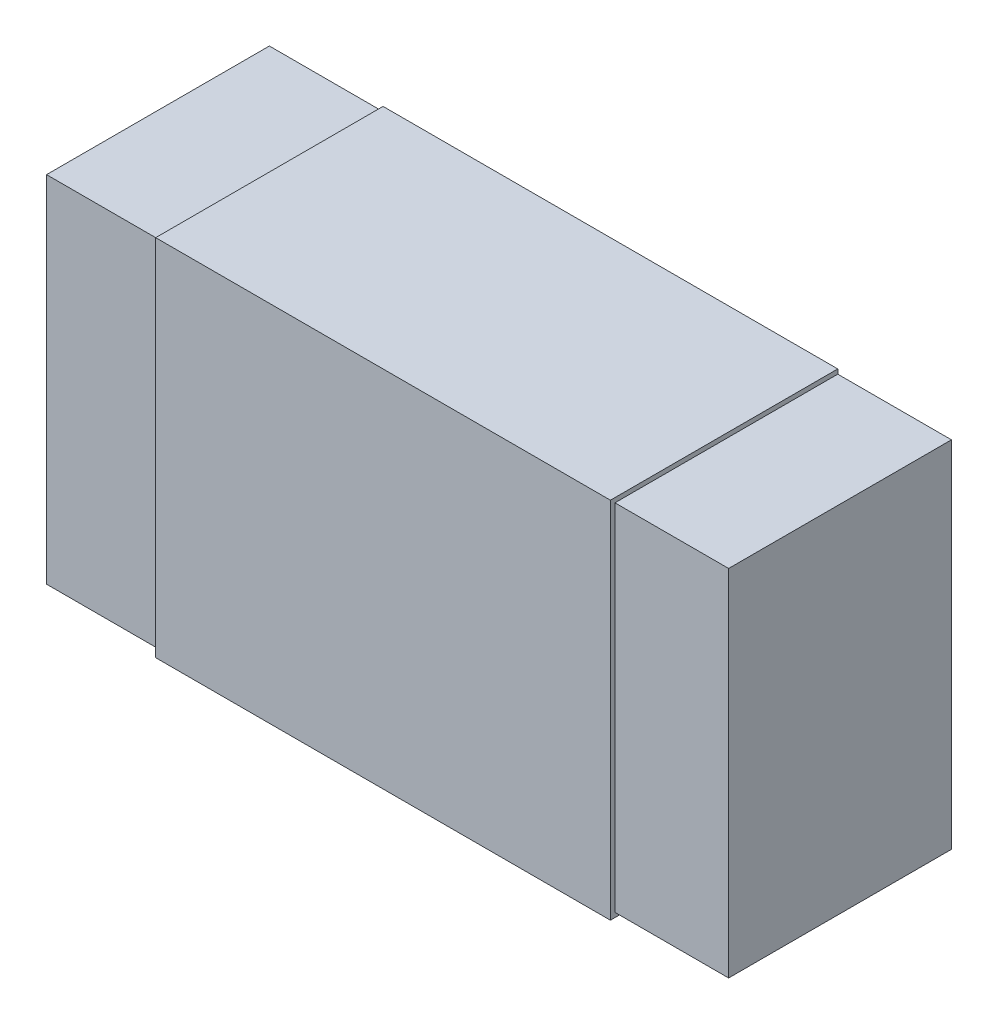
ISO-10303-21;
HEADER;
FILE_DESCRIPTION(('STEP AP214'),'2;1');
FILE_NAME('part.step','',(''),(''),'','','');
FILE_SCHEMA(('AUTOMOTIVE_DESIGN { 1 0 10303 214 1 1 1 1 }'));
ENDSEC;
DATA;
#1=APPLICATION_CONTEXT('core data for automotive mechanical design processes');
#2=APPLICATION_PROTOCOL_DEFINITION('international standard','automotive_design',2000,#1);
#3=PRODUCT_CONTEXT('',#1,'mechanical');
#4=PRODUCT('Part','Part','',(#3));
#5=PRODUCT_RELATED_PRODUCT_CATEGORY('part','',(#4));
#6=PRODUCT_DEFINITION_FORMATION('','',#4);
#7=PRODUCT_DEFINITION_CONTEXT('part definition',#1,'design');
#8=PRODUCT_DEFINITION('design','',#6,#7);
#9=PRODUCT_DEFINITION_SHAPE('','',#8);
#10=(LENGTH_UNIT() NAMED_UNIT(*) SI_UNIT(.MILLI.,.METRE.));
#11=(NAMED_UNIT(*) PLANE_ANGLE_UNIT() SI_UNIT($,.RADIAN.));
#12=(NAMED_UNIT(*) SI_UNIT($,.STERADIAN.) SOLID_ANGLE_UNIT());
#13=UNCERTAINTY_MEASURE_WITH_UNIT(LENGTH_MEASURE(1.E-05),#10,'distance_accuracy_value','');
#14=(GEOMETRIC_REPRESENTATION_CONTEXT(3) GLOBAL_UNCERTAINTY_ASSIGNED_CONTEXT((#13)) GLOBAL_UNIT_ASSIGNED_CONTEXT((#10,
#11,#12)) REPRESENTATION_CONTEXT('',''));
#15=CARTESIAN_POINT('',(0.,0.,0.));
#16=DIRECTION('',(0.,0.,1.));
#17=DIRECTION('',(1.,0.,0.));
#18=AXIS2_PLACEMENT_3D('',#15,#16,#17);
#19=CARTESIAN_POINT('',(0.,0.,0.49));
#20=DIRECTION('',(0.,0.,-1.));
#21=DIRECTION('',(0.,-1.,0.));
#22=AXIS2_PLACEMENT_3D('',#19,#20,#21);
#23=PLANE('',#22);
#24=DIRECTION('',(0.,-1.,0.));
#25=VECTOR('',#24,1.);
#26=CARTESIAN_POINT('',(-0.5,0.39,0.49));
#27=LINE('',#26,#25);
#28=CARTESIAN_POINT('',(-0.5,0.39,0.49));
#29=VERTEX_POINT('',#28);
#30=CARTESIAN_POINT('',(-0.5,-0.39,0.49));
#31=VERTEX_POINT('',#30);
#32=EDGE_CURVE('E189',#29,#31,#27,.T.);
#33=ORIENTED_EDGE('',*,*,#32,.F.);
#34=DIRECTION('',(1.,0.,0.));
#35=VECTOR('',#34,1.);
#36=CARTESIAN_POINT('',(-0.5,0.39,0.49));
#37=LINE('',#36,#35);
#38=CARTESIAN_POINT('',(-0.75,0.39,0.49));
#39=VERTEX_POINT('',#38);
#40=EDGE_CURVE('E240',#39,#29,#37,.T.);
#41=ORIENTED_EDGE('',*,*,#40,.F.);
#42=DIRECTION('',(0.,1.,0.));
#43=VECTOR('',#42,1.);
#44=CARTESIAN_POINT('',(-0.75,0.39,0.49));
#45=LINE('',#44,#43);
#46=CARTESIAN_POINT('',(-0.75,-0.39,0.49));
#47=VERTEX_POINT('',#46);
#48=EDGE_CURVE('E27',#47,#39,#45,.T.);
#49=ORIENTED_EDGE('',*,*,#48,.F.);
#50=DIRECTION('',(-1.,0.,0.));
#51=VECTOR('',#50,1.);
#52=CARTESIAN_POINT('',(-0.5,-0.39,0.49));
#53=LINE('',#52,#51);
#54=EDGE_CURVE('E11',#31,#47,#53,.T.);
#55=ORIENTED_EDGE('',*,*,#54,.F.);
#56=EDGE_LOOP('',(#33,#41,#49,#55));
#57=FACE_BOUND('',#56,.T.);
#58=ADVANCED_FACE('F16',(#57),#23,.F.);
#59=CARTESIAN_POINT('',(-0.5,-0.39,0.49));
#60=DIRECTION('',(0.,-1.,0.));
#61=DIRECTION('',(0.,0.,-1.));
#62=AXIS2_PLACEMENT_3D('',#59,#60,#61);
#63=PLANE('',#62);
#64=DIRECTION('',(-1.,0.,0.));
#65=VECTOR('',#64,1.);
#66=CARTESIAN_POINT('',(-0.5,-0.39,0.));
#67=LINE('',#66,#65);
#68=CARTESIAN_POINT('',(-0.5,-0.39,0.));
#69=VERTEX_POINT('',#68);
#70=CARTESIAN_POINT('',(-0.75,-0.39,0.));
#71=VERTEX_POINT('',#70);
#72=EDGE_CURVE('E167',#69,#71,#67,.T.);
#73=ORIENTED_EDGE('',*,*,#72,.F.);
#74=DIRECTION('',(0.,0.,-1.));
#75=VECTOR('',#74,1.);
#76=CARTESIAN_POINT('',(-0.5,-0.39,0.49));
#77=LINE('',#76,#75);
#78=EDGE_CURVE('E193',#31,#69,#77,.T.);
#79=ORIENTED_EDGE('',*,*,#78,.F.);
#80=ORIENTED_EDGE('',*,*,#54,.T.);
#81=DIRECTION('',(0.,0.,-1.));
#82=VECTOR('',#81,1.);
#83=CARTESIAN_POINT('',(-0.75,-0.39,0.49));
#84=LINE('',#83,#82);
#85=EDGE_CURVE('E20',#47,#71,#84,.T.);
#86=ORIENTED_EDGE('',*,*,#85,.T.);
#87=EDGE_LOOP('',(#73,#79,#80,#86));
#88=FACE_BOUND('',#87,.T.);
#89=ADVANCED_FACE('F272',(#88),#63,.T.);
#90=CARTESIAN_POINT('',(-0.75,0.39,0.49));
#91=DIRECTION('',(-1.,0.,0.));
#92=DIRECTION('',(0.,0.,1.));
#93=AXIS2_PLACEMENT_3D('',#90,#91,#92);
#94=PLANE('',#93);
#95=DIRECTION('',(0.,1.,0.));
#96=VECTOR('',#95,1.);
#97=CARTESIAN_POINT('',(-0.75,0.39,0.));
#98=LINE('',#97,#96);
#99=CARTESIAN_POINT('',(-0.75,0.39,0.));
#100=VERTEX_POINT('',#99);
#101=EDGE_CURVE('E162',#71,#100,#98,.T.);
#102=ORIENTED_EDGE('',*,*,#101,.F.);
#103=ORIENTED_EDGE('',*,*,#85,.F.);
#104=ORIENTED_EDGE('',*,*,#48,.T.);
#105=DIRECTION('',(0.,0.,-1.));
#106=VECTOR('',#105,1.);
#107=CARTESIAN_POINT('',(-0.75,0.39,0.49));
#108=LINE('',#107,#106);
#109=EDGE_CURVE('E206',#39,#100,#108,.T.);
#110=ORIENTED_EDGE('',*,*,#109,.T.);
#111=EDGE_LOOP('',(#102,#103,#104,#110));
#112=FACE_BOUND('',#111,.T.);
#113=ADVANCED_FACE('F268',(#112),#94,.T.);
#114=CARTESIAN_POINT('',(-0.5,0.39,0.49));
#115=DIRECTION('',(0.,1.,0.));
#116=DIRECTION('',(1.,0.,0.));
#117=AXIS2_PLACEMENT_3D('',#114,#115,#116);
#118=PLANE('',#117);
#119=DIRECTION('',(1.,0.,0.));
#120=VECTOR('',#119,1.);
#121=CARTESIAN_POINT('',(-0.5,0.39,0.));
#122=LINE('',#121,#120);
#123=CARTESIAN_POINT('',(-0.5,0.39,0.));
#124=VERTEX_POINT('',#123);
#125=EDGE_CURVE('E166',#100,#124,#122,.T.);
#126=ORIENTED_EDGE('',*,*,#125,.F.);
#127=ORIENTED_EDGE('',*,*,#109,.F.);
#128=ORIENTED_EDGE('',*,*,#40,.T.);
#129=DIRECTION('',(0.,0.,-1.));
#130=VECTOR('',#129,1.);
#131=CARTESIAN_POINT('',(-0.5,0.39,0.49));
#132=LINE('',#131,#130);
#133=EDGE_CURVE('E194',#29,#124,#132,.T.);
#134=ORIENTED_EDGE('',*,*,#133,.T.);
#135=EDGE_LOOP('',(#126,#127,#128,#134));
#136=FACE_BOUND('',#135,.T.);
#137=ADVANCED_FACE('F250',(#136),#118,.T.);
#138=CARTESIAN_POINT('',(0.,0.,0.49));
#139=DIRECTION('',(0.,0.,1.));
#140=DIRECTION('',(1.,0.,0.));
#141=AXIS2_PLACEMENT_3D('',#138,#139,#140);
#142=PLANE('',#141);
#143=DIRECTION('',(0.,1.,0.));
#144=VECTOR('',#143,1.);
#145=CARTESIAN_POINT('',(0.5,0.39,0.49));
#146=LINE('',#145,#144);
#147=CARTESIAN_POINT('',(0.5,-0.39,0.49));
#148=VERTEX_POINT('',#147);
#149=CARTESIAN_POINT('',(0.5,0.39,0.49));
#150=VERTEX_POINT('',#149);
#151=EDGE_CURVE('E218',#148,#150,#146,.T.);
#152=ORIENTED_EDGE('',*,*,#151,.F.);
#153=DIRECTION('',(-1.,0.,0.));
#154=VECTOR('',#153,1.);
#155=CARTESIAN_POINT('',(0.5,-0.39,0.49));
#156=LINE('',#155,#154);
#157=CARTESIAN_POINT('',(0.75,-0.39,0.49));
#158=VERTEX_POINT('',#157);
#159=EDGE_CURVE('E177',#158,#148,#156,.T.);
#160=ORIENTED_EDGE('',*,*,#159,.F.);
#161=DIRECTION('',(0.,-1.,0.));
#162=VECTOR('',#161,1.);
#163=CARTESIAN_POINT('',(0.75,0.39,0.49));
#164=LINE('',#163,#162);
#165=CARTESIAN_POINT('',(0.75,0.39,0.49));
#166=VERTEX_POINT('',#165);
#167=EDGE_CURVE('E207',#166,#158,#164,.T.);
#168=ORIENTED_EDGE('',*,*,#167,.F.);
#169=DIRECTION('',(1.,0.,0.));
#170=VECTOR('',#169,1.);
#171=CARTESIAN_POINT('',(0.5,0.39,0.49));
#172=LINE('',#171,#170);
#173=EDGE_CURVE('E202',#150,#166,#172,.T.);
#174=ORIENTED_EDGE('',*,*,#173,.F.);
#175=EDGE_LOOP('',(#152,#160,#168,#174));
#176=FACE_BOUND('',#175,.T.);
#177=ADVANCED_FACE('F400',(#176),#142,.T.);
#178=CARTESIAN_POINT('',(0.5,0.39,0.49));
#179=DIRECTION('',(0.,1.,0.));
#180=DIRECTION('',(1.,0.,0.));
#181=AXIS2_PLACEMENT_3D('',#178,#179,#180);
#182=PLANE('',#181);
#183=DIRECTION('',(1.,0.,0.));
#184=VECTOR('',#183,1.);
#185=CARTESIAN_POINT('',(0.5,0.39,0.));
#186=LINE('',#185,#184);
#187=CARTESIAN_POINT('',(0.5,0.39,0.));
#188=VERTEX_POINT('',#187);
#189=CARTESIAN_POINT('',(0.75,0.39,0.));
#190=VERTEX_POINT('',#189);
#191=EDGE_CURVE('E182',#188,#190,#186,.T.);
#192=ORIENTED_EDGE('',*,*,#191,.F.);
#193=DIRECTION('',(0.,0.,-1.));
#194=VECTOR('',#193,1.);
#195=CARTESIAN_POINT('',(0.5,0.39,0.49));
#196=LINE('',#195,#194);
#197=EDGE_CURVE('E160',#150,#188,#196,.T.);
#198=ORIENTED_EDGE('',*,*,#197,.F.);
#199=ORIENTED_EDGE('',*,*,#173,.T.);
#200=DIRECTION('',(0.,0.,-1.));
#201=VECTOR('',#200,1.);
#202=CARTESIAN_POINT('',(0.75,0.39,0.49));
#203=LINE('',#202,#201);
#204=EDGE_CURVE('E180',#166,#190,#203,.T.);
#205=ORIENTED_EDGE('',*,*,#204,.T.);
#206=EDGE_LOOP('',(#192,#198,#199,#205));
#207=FACE_BOUND('',#206,.T.);
#208=ADVANCED_FACE('F287',(#207),#182,.T.);
#209=CARTESIAN_POINT('',(0.75,0.39,0.49));
#210=DIRECTION('',(1.,0.,0.));
#211=DIRECTION('',(0.,-1.,0.));
#212=AXIS2_PLACEMENT_3D('',#209,#210,#211);
#213=PLANE('',#212);
#214=DIRECTION('',(0.,-1.,0.));
#215=VECTOR('',#214,1.);
#216=CARTESIAN_POINT('',(0.75,0.39,0.));
#217=LINE('',#216,#215);
#218=CARTESIAN_POINT('',(0.75,-0.39,0.));
#219=VERTEX_POINT('',#218);
#220=EDGE_CURVE('E186',#190,#219,#217,.T.);
#221=ORIENTED_EDGE('',*,*,#220,.F.);
#222=ORIENTED_EDGE('',*,*,#204,.F.);
#223=ORIENTED_EDGE('',*,*,#167,.T.);
#224=DIRECTION('',(0.,0.,-1.));
#225=VECTOR('',#224,1.);
#226=CARTESIAN_POINT('',(0.75,-0.39,0.49));
#227=LINE('',#226,#225);
#228=EDGE_CURVE('E181',#158,#219,#227,.T.);
#229=ORIENTED_EDGE('',*,*,#228,.T.);
#230=EDGE_LOOP('',(#221,#222,#223,#229));
#231=FACE_BOUND('',#230,.T.);
#232=ADVANCED_FACE('F292',(#231),#213,.T.);
#233=CARTESIAN_POINT('',(0.5,-0.39,0.49));
#234=DIRECTION('',(0.,-1.,0.));
#235=DIRECTION('',(-1.,0.,0.));
#236=AXIS2_PLACEMENT_3D('',#233,#234,#235);
#237=PLANE('',#236);
#238=DIRECTION('',(-1.,0.,0.));
#239=VECTOR('',#238,1.);
#240=CARTESIAN_POINT('',(0.5,-0.39,0.));
#241=LINE('',#240,#239);
#242=CARTESIAN_POINT('',(0.5,-0.39,0.));
#243=VERTEX_POINT('',#242);
#244=EDGE_CURVE('E197',#219,#243,#241,.T.);
#245=ORIENTED_EDGE('',*,*,#244,.F.);
#246=ORIENTED_EDGE('',*,*,#228,.F.);
#247=ORIENTED_EDGE('',*,*,#159,.T.);
#248=DIRECTION('',(0.,0.,-1.));
#249=VECTOR('',#248,1.);
#250=CARTESIAN_POINT('',(0.5,-0.39,0.49));
#251=LINE('',#250,#249);
#252=EDGE_CURVE('E222',#148,#243,#251,.T.);
#253=ORIENTED_EDGE('',*,*,#252,.T.);
#254=EDGE_LOOP('',(#245,#246,#247,#253));
#255=FACE_BOUND('',#254,.T.);
#256=ADVANCED_FACE('F299',(#255),#237,.T.);
#257=CARTESIAN_POINT('',(0.,0.,0.));
#258=DIRECTION('',(0.,0.,1.));
#259=DIRECTION('',(1.,0.,0.));
#260=AXIS2_PLACEMENT_3D('',#257,#258,#259);
#261=PLANE('',#260);
#262=DIRECTION('',(0.,1.,0.));
#263=VECTOR('',#262,1.);
#264=CARTESIAN_POINT('',(0.5,0.4,0.));
#265=LINE('',#264,#263);
#266=CARTESIAN_POINT('',(0.5,-0.4,0.));
#267=VERTEX_POINT('',#266);
#268=EDGE_CURVE('E225',#267,#243,#265,.T.);
#269=ORIENTED_EDGE('',*,*,#268,.F.);
#270=DIRECTION('',(1.,0.,0.));
#271=VECTOR('',#270,1.);
#272=CARTESIAN_POINT('',(-0.5,-0.4,0.));
#273=LINE('',#272,#271);
#274=CARTESIAN_POINT('',(-0.5,-0.4,0.));
#275=VERTEX_POINT('',#274);
#276=EDGE_CURVE('E134',#275,#267,#273,.T.);
#277=ORIENTED_EDGE('',*,*,#276,.F.);
#278=DIRECTION('',(0.,-1.,0.));
#279=VECTOR('',#278,1.);
#280=CARTESIAN_POINT('',(-0.5,0.4,0.));
#281=LINE('',#280,#279);
#282=EDGE_CURVE('E156',#69,#275,#281,.T.);
#283=ORIENTED_EDGE('',*,*,#282,.F.);
#284=ORIENTED_EDGE('',*,*,#72,.T.);
#285=ORIENTED_EDGE('',*,*,#101,.T.);
#286=ORIENTED_EDGE('',*,*,#125,.T.);
#287=DIRECTION('',(0.,-1.,0.));
#288=VECTOR('',#287,1.);
#289=CARTESIAN_POINT('',(-0.5,0.4,0.));
#290=LINE('',#289,#288);
#291=CARTESIAN_POINT('',(-0.5,0.4,0.));
#292=VERTEX_POINT('',#291);
#293=EDGE_CURVE('E144',#292,#124,#290,.T.);
#294=ORIENTED_EDGE('',*,*,#293,.F.);
#295=DIRECTION('',(-1.,0.,0.));
#296=VECTOR('',#295,1.);
#297=CARTESIAN_POINT('',(-0.5,0.4,0.));
#298=LINE('',#297,#296);
#299=CARTESIAN_POINT('',(0.5,0.4,0.));
#300=VERTEX_POINT('',#299);
#301=EDGE_CURVE('E135',#300,#292,#298,.T.);
#302=ORIENTED_EDGE('',*,*,#301,.F.);
#303=DIRECTION('',(0.,1.,0.));
#304=VECTOR('',#303,1.);
#305=CARTESIAN_POINT('',(0.5,0.4,0.));
#306=LINE('',#305,#304);
#307=EDGE_CURVE('E208',#188,#300,#306,.T.);
#308=ORIENTED_EDGE('',*,*,#307,.F.);
#309=ORIENTED_EDGE('',*,*,#191,.T.);
#310=ORIENTED_EDGE('',*,*,#220,.T.);
#311=ORIENTED_EDGE('',*,*,#244,.T.);
#312=EDGE_LOOP('',(#269,#277,#283,#284,#285,#286,#294,#302,#308,#309,#310,#311));
#313=FACE_BOUND('',#312,.T.);
#314=ADVANCED_FACE('F274',(#313),#261,.F.);
#315=CARTESIAN_POINT('',(0.,0.,0.5));
#316=DIRECTION('',(0.,0.,1.));
#317=DIRECTION('',(1.,0.,0.));
#318=AXIS2_PLACEMENT_3D('',#315,#316,#317);
#319=PLANE('',#318);
#320=DIRECTION('',(0.,1.,0.));
#321=VECTOR('',#320,1.);
#322=CARTESIAN_POINT('',(0.5,0.4,0.5));
#323=LINE('',#322,#321);
#324=CARTESIAN_POINT('',(0.5,-0.4,0.5));
#325=VERTEX_POINT('',#324);
#326=CARTESIAN_POINT('',(0.5,0.4,0.5));
#327=VERTEX_POINT('',#326);
#328=EDGE_CURVE('E129',#325,#327,#323,.T.);
#329=ORIENTED_EDGE('',*,*,#328,.T.);
#330=DIRECTION('',(-1.,0.,0.));
#331=VECTOR('',#330,1.);
#332=CARTESIAN_POINT('',(-0.5,0.4,0.5));
#333=LINE('',#332,#331);
#334=CARTESIAN_POINT('',(-0.5,0.4,0.5));
#335=VERTEX_POINT('',#334);
#336=EDGE_CURVE('E122',#327,#335,#333,.T.);
#337=ORIENTED_EDGE('',*,*,#336,.T.);
#338=DIRECTION('',(0.,-1.,0.));
#339=VECTOR('',#338,1.);
#340=CARTESIAN_POINT('',(-0.5,0.4,0.5));
#341=LINE('',#340,#339);
#342=CARTESIAN_POINT('',(-0.5,-0.4,0.5));
#343=VERTEX_POINT('',#342);
#344=EDGE_CURVE('E126',#335,#343,#341,.T.);
#345=ORIENTED_EDGE('',*,*,#344,.T.);
#346=DIRECTION('',(1.,0.,0.));
#347=VECTOR('',#346,1.);
#348=CARTESIAN_POINT('',(-0.5,-0.4,0.5));
#349=LINE('',#348,#347);
#350=EDGE_CURVE('E174',#343,#325,#349,.T.);
#351=ORIENTED_EDGE('',*,*,#350,.T.);
#352=EDGE_LOOP('',(#329,#337,#345,#351));
#353=FACE_BOUND('',#352,.T.);
#354=ADVANCED_FACE('F124',(#353),#319,.T.);
#355=CARTESIAN_POINT('',(-0.5,-0.4,0.5));
#356=DIRECTION('',(0.,1.,0.));
#357=DIRECTION('',(1.,0.,0.));
#358=AXIS2_PLACEMENT_3D('',#355,#356,#357);
#359=PLANE('',#358);
#360=ORIENTED_EDGE('',*,*,#276,.T.);
#361=DIRECTION('',(0.,0.,-1.));
#362=VECTOR('',#361,1.);
#363=CARTESIAN_POINT('',(0.5,-0.4,0.5));
#364=LINE('',#363,#362);
#365=EDGE_CURVE('E172',#325,#267,#364,.T.);
#366=ORIENTED_EDGE('',*,*,#365,.F.);
#367=ORIENTED_EDGE('',*,*,#350,.F.);
#368=DIRECTION('',(0.,0.,-1.));
#369=VECTOR('',#368,1.);
#370=CARTESIAN_POINT('',(-0.5,-0.4,0.5));
#371=LINE('',#370,#369);
#372=EDGE_CURVE('E149',#343,#275,#371,.T.);
#373=ORIENTED_EDGE('',*,*,#372,.T.);
#374=EDGE_LOOP('',(#360,#366,#367,#373));
#375=FACE_BOUND('',#374,.T.);
#376=ADVANCED_FACE('F18',(#375),#359,.F.);
#377=CARTESIAN_POINT('',(-0.5,0.4,0.5));
#378=DIRECTION('',(0.,-1.,0.));
#379=DIRECTION('',(0.,0.,-1.));
#380=AXIS2_PLACEMENT_3D('',#377,#378,#379);
#381=PLANE('',#380);
#382=ORIENTED_EDGE('',*,*,#301,.T.);
#383=DIRECTION('',(0.,0.,-1.));
#384=VECTOR('',#383,1.);
#385=CARTESIAN_POINT('',(-0.5,0.4,0.5));
#386=LINE('',#385,#384);
#387=EDGE_CURVE('E138',#335,#292,#386,.T.);
#388=ORIENTED_EDGE('',*,*,#387,.F.);
#389=ORIENTED_EDGE('',*,*,#336,.F.);
#390=DIRECTION('',(0.,0.,-1.));
#391=VECTOR('',#390,1.);
#392=CARTESIAN_POINT('',(0.5,0.4,0.5));
#393=LINE('',#392,#391);
#394=EDGE_CURVE('E173',#327,#300,#393,.T.);
#395=ORIENTED_EDGE('',*,*,#394,.T.);
#396=EDGE_LOOP('',(#382,#388,#389,#395));
#397=FACE_BOUND('',#396,.T.);
#398=ADVANCED_FACE('F139',(#397),#381,.F.);
#399=CARTESIAN_POINT('',(0.5,0.4,0.5));
#400=DIRECTION('',(-1.,0.,0.));
#401=DIRECTION('',(0.,1.,0.));
#402=AXIS2_PLACEMENT_3D('',#399,#400,#401);
#403=PLANE('',#402);
#404=ORIENTED_EDGE('',*,*,#252,.F.);
#405=ORIENTED_EDGE('',*,*,#151,.T.);
#406=ORIENTED_EDGE('',*,*,#197,.T.);
#407=ORIENTED_EDGE('',*,*,#307,.T.);
#408=ORIENTED_EDGE('',*,*,#394,.F.);
#409=ORIENTED_EDGE('',*,*,#328,.F.);
#410=ORIENTED_EDGE('',*,*,#365,.T.);
#411=ORIENTED_EDGE('',*,*,#268,.T.);
#412=EDGE_LOOP('',(#404,#405,#406,#407,#408,#409,#410,#411));
#413=FACE_BOUND('',#412,.T.);
#414=ADVANCED_FACE('F281',(#413),#403,.F.);
#415=CARTESIAN_POINT('',(-0.5,0.4,0.5));
#416=DIRECTION('',(1.,0.,0.));
#417=DIRECTION('',(0.,1.,0.));
#418=AXIS2_PLACEMENT_3D('',#415,#416,#417);
#419=PLANE('',#418);
#420=ORIENTED_EDGE('',*,*,#133,.F.);
#421=ORIENTED_EDGE('',*,*,#32,.T.);
#422=ORIENTED_EDGE('',*,*,#78,.T.);
#423=ORIENTED_EDGE('',*,*,#282,.T.);
#424=ORIENTED_EDGE('',*,*,#372,.F.);
#425=ORIENTED_EDGE('',*,*,#344,.F.);
#426=ORIENTED_EDGE('',*,*,#387,.T.);
#427=ORIENTED_EDGE('',*,*,#293,.T.);
#428=EDGE_LOOP('',(#420,#421,#422,#423,#424,#425,#426,#427));
#429=FACE_BOUND('',#428,.T.);
#430=ADVANCED_FACE('F146',(#429),#419,.F.);
#431=CLOSED_SHELL('',(#58,#89,#113,#137,#177,#208,#232,#256,#314,#354,#376,#398,#414,#430));
#432=MANIFOLD_SOLID_BREP('B1',#431);
#433=ADVANCED_BREP_SHAPE_REPRESENTATION('',(#18,#432),#14);
#434=SHAPE_DEFINITION_REPRESENTATION(#9,#433);
ENDSEC;
END-ISO-10303-21;
